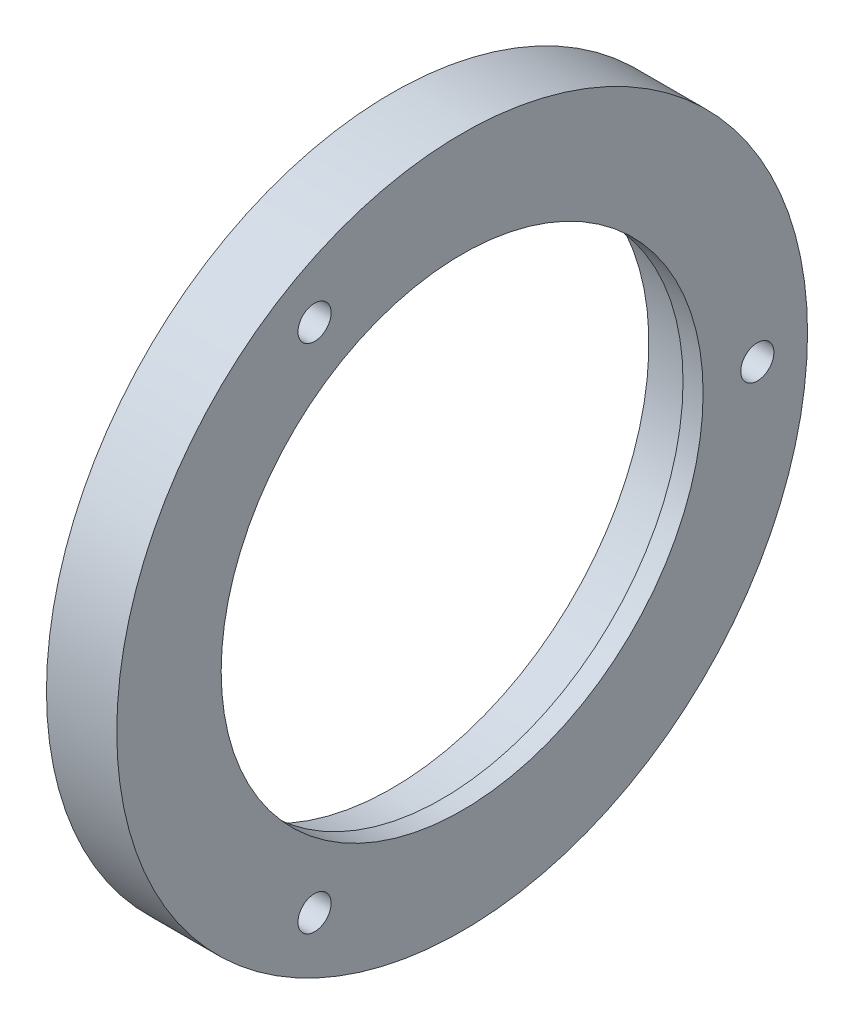
ISO-10303-21;
HEADER;
FILE_DESCRIPTION(('STEP AP214'),'2;1');
FILE_NAME('part.step','',(''),(''),'','','');
FILE_SCHEMA(('AUTOMOTIVE_DESIGN { 1 0 10303 214 1 1 1 1 }'));
ENDSEC;
DATA;
#1=APPLICATION_CONTEXT('core data for automotive mechanical design processes');
#2=APPLICATION_PROTOCOL_DEFINITION('international standard','automotive_design',2000,#1);
#3=PRODUCT_CONTEXT('',#1,'mechanical');
#4=PRODUCT('Part','Part','',(#3));
#5=PRODUCT_RELATED_PRODUCT_CATEGORY('part','',(#4));
#6=PRODUCT_DEFINITION_FORMATION('','',#4);
#7=PRODUCT_DEFINITION_CONTEXT('part definition',#1,'design');
#8=PRODUCT_DEFINITION('design','',#6,#7);
#9=PRODUCT_DEFINITION_SHAPE('','',#8);
#10=(LENGTH_UNIT() NAMED_UNIT(*) SI_UNIT(.MILLI.,.METRE.));
#11=(NAMED_UNIT(*) PLANE_ANGLE_UNIT() SI_UNIT($,.RADIAN.));
#12=(NAMED_UNIT(*) SI_UNIT($,.STERADIAN.) SOLID_ANGLE_UNIT());
#13=UNCERTAINTY_MEASURE_WITH_UNIT(LENGTH_MEASURE(1.E-05),#10,'distance_accuracy_value','');
#14=(GEOMETRIC_REPRESENTATION_CONTEXT(3) GLOBAL_UNCERTAINTY_ASSIGNED_CONTEXT((#13)) GLOBAL_UNIT_ASSIGNED_CONTEXT((#10,
#11,#12)) REPRESENTATION_CONTEXT('',''));
#15=CARTESIAN_POINT('',(0.,0.,0.));
#16=DIRECTION('',(0.,0.,1.));
#17=DIRECTION('',(1.,0.,0.));
#18=AXIS2_PLACEMENT_3D('',#15,#16,#17);
#19=CARTESIAN_POINT('',(169.7,34.4,0.));
#20=DIRECTION('',(1.,0.,0.));
#21=DIRECTION('',(0.,0.,-1.));
#22=AXIS2_PLACEMENT_3D('',#19,#20,#21);
#23=PLANE('',#22);
#24=CARTESIAN_POINT('',(169.7,0.,-29.4));
#25=DIRECTION('',(1.,0.,0.));
#26=DIRECTION('',(0.,0.,-1.));
#27=AXIS2_PLACEMENT_3D('',#24,#25,#26);
#28=CIRCLE('',#27,1.65);
#29=CARTESIAN_POINT('',(169.7,0.,-27.75));
#30=VERTEX_POINT('',#29);
#31=EDGE_CURVE('E68',#30,#30,#28,.F.);
#32=ORIENTED_EDGE('',*,*,#31,.F.);
#33=EDGE_LOOP('',(#32));
#34=FACE_BOUND('',#33,.T.);
#35=CARTESIAN_POINT('',(169.7,25.4611468712625,14.7));
#36=DIRECTION('',(1.,0.,0.));
#37=DIRECTION('',(0.,0.,-1.));
#38=AXIS2_PLACEMENT_3D('',#35,#36,#37);
#39=CIRCLE('',#38,1.65);
#40=CARTESIAN_POINT('',(169.7,25.4611468712625,16.35));
#41=VERTEX_POINT('',#40);
#42=EDGE_CURVE('E72',#41,#41,#39,.F.);
#43=ORIENTED_EDGE('',*,*,#42,.F.);
#44=EDGE_LOOP('',(#43));
#45=FACE_BOUND('',#44,.T.);
#46=CARTESIAN_POINT('',(169.7,-25.4611468712625,14.7));
#47=DIRECTION('',(1.,0.,0.));
#48=DIRECTION('',(0.,0.,-1.));
#49=AXIS2_PLACEMENT_3D('',#46,#47,#48);
#50=CIRCLE('',#49,1.65);
#51=CARTESIAN_POINT('',(169.7,-25.4611468712625,16.35));
#52=VERTEX_POINT('',#51);
#53=EDGE_CURVE('E76',#52,#52,#50,.F.);
#54=ORIENTED_EDGE('',*,*,#53,.F.);
#55=EDGE_LOOP('',(#54));
#56=FACE_BOUND('',#55,.T.);
#57=CARTESIAN_POINT('',(169.7,0.,0.));
#58=DIRECTION('',(-1.,0.,0.));
#59=DIRECTION('',(0.,0.,1.));
#60=AXIS2_PLACEMENT_3D('',#57,#58,#59);
#61=CIRCLE('',#60,25.6);
#62=CARTESIAN_POINT('',(169.7,0.,25.6));
#63=VERTEX_POINT('',#62);
#64=EDGE_CURVE('E10',#63,#63,#61,.T.);
#65=ORIENTED_EDGE('',*,*,#64,.F.);
#66=EDGE_LOOP('',(#65));
#67=FACE_BOUND('',#66,.T.);
#68=CARTESIAN_POINT('',(169.7,0.,0.));
#69=DIRECTION('',(-1.,0.,0.));
#70=DIRECTION('',(0.,0.,1.));
#71=AXIS2_PLACEMENT_3D('',#68,#69,#70);
#72=CIRCLE('',#71,34.4);
#73=CARTESIAN_POINT('',(169.7,0.,34.4));
#74=VERTEX_POINT('',#73);
#75=EDGE_CURVE('E64',#74,#74,#72,.T.);
#76=ORIENTED_EDGE('',*,*,#75,.T.);
#77=EDGE_LOOP('',(#76));
#78=FACE_BOUND('',#77,.T.);
#79=ADVANCED_FACE('F37',(#34,#45,#56,#67,#78),#23,.F.);
#80=CARTESIAN_POINT('',(-110.,0.,0.));
#81=DIRECTION('',(-1.,0.,0.));
#82=DIRECTION('',(0.,0.,1.));
#83=AXIS2_PLACEMENT_3D('',#80,#81,#82);
#84=CYLINDRICAL_SURFACE('',#83,25.6);
#85=CARTESIAN_POINT('',(174.7,0.,0.));
#86=DIRECTION('',(-1.,0.,0.));
#87=DIRECTION('',(0.,0.,1.));
#88=AXIS2_PLACEMENT_3D('',#85,#86,#87);
#89=CIRCLE('',#88,25.6);
#90=CARTESIAN_POINT('',(174.7,0.,25.6));
#91=VERTEX_POINT('',#90);
#92=EDGE_CURVE('E44',#91,#91,#89,.T.);
#93=ORIENTED_EDGE('',*,*,#92,.F.);
#94=EDGE_LOOP('',(#93));
#95=FACE_BOUND('',#94,.T.);
#96=ORIENTED_EDGE('',*,*,#64,.T.);
#97=EDGE_LOOP('',(#96));
#98=FACE_BOUND('',#97,.T.);
#99=ADVANCED_FACE('F117',(#95,#98),#84,.F.);
#100=CARTESIAN_POINT('',(174.7,25.6,0.));
#101=DIRECTION('',(1.,0.,0.));
#102=DIRECTION('',(0.,0.,-1.));
#103=AXIS2_PLACEMENT_3D('',#100,#101,#102);
#104=PLANE('',#103);
#105=CARTESIAN_POINT('',(174.7,0.,0.));
#106=DIRECTION('',(-1.,0.,0.));
#107=DIRECTION('',(0.,0.,1.));
#108=AXIS2_PLACEMENT_3D('',#105,#106,#107);
#109=CIRCLE('',#108,24.);
#110=CARTESIAN_POINT('',(174.7,0.,24.));
#111=VERTEX_POINT('',#110);
#112=EDGE_CURVE('E49',#111,#111,#109,.T.);
#113=ORIENTED_EDGE('',*,*,#112,.F.);
#114=EDGE_LOOP('',(#113));
#115=FACE_BOUND('',#114,.T.);
#116=ORIENTED_EDGE('',*,*,#92,.T.);
#117=EDGE_LOOP('',(#116));
#118=FACE_BOUND('',#117,.T.);
#119=ADVANCED_FACE('F112',(#115,#118),#104,.F.);
#120=CARTESIAN_POINT('',(-110.,0.,0.));
#121=DIRECTION('',(-1.,0.,0.));
#122=DIRECTION('',(0.,0.,1.));
#123=AXIS2_PLACEMENT_3D('',#120,#121,#122);
#124=CYLINDRICAL_SURFACE('',#123,24.);
#125=CARTESIAN_POINT('',(176.7,0.,0.));
#126=DIRECTION('',(-1.,0.,0.));
#127=DIRECTION('',(0.,0.,1.));
#128=AXIS2_PLACEMENT_3D('',#125,#126,#127);
#129=CIRCLE('',#128,24.);
#130=CARTESIAN_POINT('',(176.7,0.,24.));
#131=VERTEX_POINT('',#130);
#132=EDGE_CURVE('E54',#131,#131,#129,.T.);
#133=ORIENTED_EDGE('',*,*,#132,.F.);
#134=EDGE_LOOP('',(#133));
#135=FACE_BOUND('',#134,.T.);
#136=ORIENTED_EDGE('',*,*,#112,.T.);
#137=EDGE_LOOP('',(#136));
#138=FACE_BOUND('',#137,.T.);
#139=ADVANCED_FACE('F100',(#135,#138),#124,.F.);
#140=CARTESIAN_POINT('',(176.7,24.,0.));
#141=DIRECTION('',(-1.,0.,0.));
#142=DIRECTION('',(0.,0.,1.));
#143=AXIS2_PLACEMENT_3D('',#140,#141,#142);
#144=PLANE('',#143);
#145=CARTESIAN_POINT('',(176.7,0.,-29.4));
#146=DIRECTION('',(1.,0.,0.));
#147=DIRECTION('',(0.,0.,-1.));
#148=AXIS2_PLACEMENT_3D('',#145,#146,#147);
#149=CIRCLE('',#148,1.65);
#150=CARTESIAN_POINT('',(176.7,0.,-27.75));
#151=VERTEX_POINT('',#150);
#152=EDGE_CURVE('E80',#151,#151,#149,.T.);
#153=ORIENTED_EDGE('',*,*,#152,.F.);
#154=EDGE_LOOP('',(#153));
#155=FACE_BOUND('',#154,.T.);
#156=CARTESIAN_POINT('',(176.7,25.4611468712625,14.7));
#157=DIRECTION('',(1.,0.,0.));
#158=DIRECTION('',(0.,0.,-1.));
#159=AXIS2_PLACEMENT_3D('',#156,#157,#158);
#160=CIRCLE('',#159,1.65);
#161=CARTESIAN_POINT('',(176.7,25.4611468712625,16.35));
#162=VERTEX_POINT('',#161);
#163=EDGE_CURVE('E85',#162,#162,#160,.T.);
#164=ORIENTED_EDGE('',*,*,#163,.F.);
#165=EDGE_LOOP('',(#164));
#166=FACE_BOUND('',#165,.T.);
#167=CARTESIAN_POINT('',(176.7,-25.4611468712625,14.7));
#168=DIRECTION('',(1.,0.,0.));
#169=DIRECTION('',(0.,0.,-1.));
#170=AXIS2_PLACEMENT_3D('',#167,#168,#169);
#171=CIRCLE('',#170,1.65);
#172=CARTESIAN_POINT('',(176.7,-25.4611468712625,16.35));
#173=VERTEX_POINT('',#172);
#174=EDGE_CURVE('E81',#173,#173,#171,.T.);
#175=ORIENTED_EDGE('',*,*,#174,.F.);
#176=EDGE_LOOP('',(#175));
#177=FACE_BOUND('',#176,.T.);
#178=CARTESIAN_POINT('',(176.7,0.,0.));
#179=DIRECTION('',(-1.,0.,0.));
#180=DIRECTION('',(0.,0.,1.));
#181=AXIS2_PLACEMENT_3D('',#178,#179,#180);
#182=CIRCLE('',#181,34.4);
#183=CARTESIAN_POINT('',(176.7,0.,34.4));
#184=VERTEX_POINT('',#183);
#185=EDGE_CURVE('E60',#184,#184,#182,.T.);
#186=ORIENTED_EDGE('',*,*,#185,.F.);
#187=EDGE_LOOP('',(#186));
#188=FACE_BOUND('',#187,.T.);
#189=ORIENTED_EDGE('',*,*,#132,.T.);
#190=EDGE_LOOP('',(#189));
#191=FACE_BOUND('',#190,.T.);
#192=ADVANCED_FACE('F96',(#155,#166,#177,#188,#191),#144,.F.);
#193=CARTESIAN_POINT('',(-110.,0.,0.));
#194=DIRECTION('',(-1.,0.,0.));
#195=DIRECTION('',(0.,0.,1.));
#196=AXIS2_PLACEMENT_3D('',#193,#194,#195);
#197=CYLINDRICAL_SURFACE('',#196,34.4);
#198=ORIENTED_EDGE('',*,*,#75,.F.);
#199=EDGE_LOOP('',(#198));
#200=FACE_BOUND('',#199,.T.);
#201=ORIENTED_EDGE('',*,*,#185,.T.);
#202=EDGE_LOOP('',(#201));
#203=FACE_BOUND('',#202,.T.);
#204=ADVANCED_FACE('F99',(#200,#203),#197,.T.);
#205=CARTESIAN_POINT('',(169.7,-25.4611468712625,14.7));
#206=DIRECTION('',(-1.,0.,0.));
#207=DIRECTION('',(0.,0.,1.));
#208=AXIS2_PLACEMENT_3D('',#205,#206,#207);
#209=CYLINDRICAL_SURFACE('',#208,1.65);
#210=CARTESIAN_POINT('',(176.7,-25.4611468712625,16.35));
#211=CARTESIAN_POINT('',(176.627083333333,-25.4611468712625,16.35));
#212=CARTESIAN_POINT('',(176.554166666667,-25.4611468712625,16.35));
#213=CARTESIAN_POINT('',(176.408333333333,-25.4611468712625,16.35));
#214=CARTESIAN_POINT('',(176.335416666667,-25.4611468712625,16.35));
#215=CARTESIAN_POINT('',(176.189583333333,-25.4611468712625,16.35));
#216=CARTESIAN_POINT('',(176.116666666667,-25.4611468712625,16.35));
#217=CARTESIAN_POINT('',(175.970833333333,-25.4611468712625,16.35));
#218=CARTESIAN_POINT('',(175.897916666667,-25.4611468712625,16.35));
#219=CARTESIAN_POINT('',(175.752083333333,-25.4611468712625,16.35));
#220=CARTESIAN_POINT('',(175.679166666667,-25.4611468712625,16.35));
#221=CARTESIAN_POINT('',(175.533333333333,-25.4611468712625,16.35));
#222=CARTESIAN_POINT('',(175.460416666667,-25.4611468712625,16.35));
#223=CARTESIAN_POINT('',(175.314583333333,-25.4611468712625,16.35));
#224=CARTESIAN_POINT('',(175.241666666667,-25.4611468712625,16.35));
#225=CARTESIAN_POINT('',(175.095833333333,-25.4611468712625,16.35));
#226=CARTESIAN_POINT('',(175.022916666667,-25.4611468712625,16.35));
#227=CARTESIAN_POINT('',(174.877083333333,-25.4611468712625,16.35));
#228=CARTESIAN_POINT('',(174.804166666667,-25.4611468712625,16.35));
#229=CARTESIAN_POINT('',(174.658333333333,-25.4611468712625,16.35));
#230=CARTESIAN_POINT('',(174.585416666667,-25.4611468712625,16.35));
#231=CARTESIAN_POINT('',(174.439583333333,-25.4611468712625,16.35));
#232=CARTESIAN_POINT('',(174.366666666667,-25.4611468712625,16.35));
#233=CARTESIAN_POINT('',(174.220833333333,-25.4611468712625,16.35));
#234=CARTESIAN_POINT('',(174.147916666667,-25.4611468712625,16.35));
#235=CARTESIAN_POINT('',(174.002083333333,-25.4611468712625,16.35));
#236=CARTESIAN_POINT('',(173.929166666667,-25.4611468712625,16.35));
#237=CARTESIAN_POINT('',(173.783333333333,-25.4611468712625,16.35));
#238=CARTESIAN_POINT('',(173.710416666667,-25.4611468712625,16.35));
#239=CARTESIAN_POINT('',(173.564583333333,-25.4611468712625,16.35));
#240=CARTESIAN_POINT('',(173.491666666667,-25.4611468712625,16.35));
#241=CARTESIAN_POINT('',(173.345833333333,-25.4611468712625,16.35));
#242=CARTESIAN_POINT('',(173.272916666667,-25.4611468712625,16.35));
#243=CARTESIAN_POINT('',(173.127083333333,-25.4611468712625,16.35));
#244=CARTESIAN_POINT('',(173.054166666667,-25.4611468712625,16.35));
#245=CARTESIAN_POINT('',(172.908333333333,-25.4611468712625,16.35));
#246=CARTESIAN_POINT('',(172.835416666667,-25.4611468712625,16.35));
#247=CARTESIAN_POINT('',(172.689583333333,-25.4611468712625,16.35));
#248=CARTESIAN_POINT('',(172.616666666667,-25.4611468712625,16.35));
#249=CARTESIAN_POINT('',(172.470833333333,-25.4611468712625,16.35));
#250=CARTESIAN_POINT('',(172.397916666667,-25.4611468712625,16.35));
#251=CARTESIAN_POINT('',(172.252083333333,-25.4611468712625,16.35));
#252=CARTESIAN_POINT('',(172.179166666667,-25.4611468712625,16.35));
#253=CARTESIAN_POINT('',(172.033333333333,-25.4611468712625,16.35));
#254=CARTESIAN_POINT('',(171.960416666667,-25.4611468712625,16.35));
#255=CARTESIAN_POINT('',(171.814583333333,-25.4611468712625,16.35));
#256=CARTESIAN_POINT('',(171.741666666667,-25.4611468712625,16.35));
#257=CARTESIAN_POINT('',(171.595833333333,-25.4611468712625,16.35));
#258=CARTESIAN_POINT('',(171.522916666667,-25.4611468712625,16.35));
#259=CARTESIAN_POINT('',(171.377083333333,-25.4611468712625,16.35));
#260=CARTESIAN_POINT('',(171.304166666667,-25.4611468712625,16.35));
#261=CARTESIAN_POINT('',(171.158333333333,-25.4611468712625,16.35));
#262=CARTESIAN_POINT('',(171.085416666667,-25.4611468712625,16.35));
#263=CARTESIAN_POINT('',(170.939583333333,-25.4611468712625,16.35));
#264=CARTESIAN_POINT('',(170.866666666667,-25.4611468712625,16.35));
#265=CARTESIAN_POINT('',(170.720833333333,-25.4611468712625,16.35));
#266=CARTESIAN_POINT('',(170.647916666667,-25.4611468712625,16.35));
#267=CARTESIAN_POINT('',(170.502083333333,-25.4611468712625,16.35));
#268=CARTESIAN_POINT('',(170.429166666667,-25.4611468712625,16.35));
#269=CARTESIAN_POINT('',(170.283333333333,-25.4611468712625,16.35));
#270=CARTESIAN_POINT('',(170.210416666667,-25.4611468712625,16.35));
#271=CARTESIAN_POINT('',(170.064583333333,-25.4611468712625,16.35));
#272=CARTESIAN_POINT('',(169.991666666667,-25.4611468712625,16.35));
#273=CARTESIAN_POINT('',(169.845833333333,-25.4611468712625,16.35));
#274=CARTESIAN_POINT('',(169.772916666667,-25.4611468712625,16.35));
#275=CARTESIAN_POINT('',(169.7,-25.4611468712625,16.35));
#276=B_SPLINE_CURVE_WITH_KNOTS('',3,(#210,#211,#212,#213,#214,#215,#216,#217,#218,#219,#220,
#221,#222,#223,#224,#225,#226,#227,#228,#229,#230,#231,#232,#233,#234,#235,#236,#237,#238,#239,
#240,#241,#242,#243,#244,#245,#246,#247,#248,#249,#250,#251,#252,#253,#254,#255,#256,#257,#258,
#259,#260,#261,#262,#263,#264,#265,#266,#267,#268,#269,#270,#271,#272,#273,#274,#275),
.UNSPECIFIED.,.F.,.F.,(4,2,2,2,2,2,2,2,2,2,2,2,2,2,2,2,2,2,2,2,2,2,2,2,2,2,2,2,2,2,2,2,4),(0.,
0.21874999999999,0.43749999999998,0.656249999999997,0.874999999999987,1.09375,1.31249999999999,
1.53124999999998,1.75,1.96874999999999,2.18750000000001,2.40625,2.62499999999999,
2.84375000000001,3.0625,3.28125000000001,3.5,3.71874999999999,3.93750000000001,4.15625,
4.37500000000002,4.59375000000001,4.8125,5.03125000000002,5.25,5.46875000000002,
5.68750000000001,5.90625,6.12500000000002,6.34375000000001,6.56250000000003,6.78125000000002,
7.00000000000001),.UNSPECIFIED.);
#277=EDGE_CURVE('BSEAM138',#173,#52,#276,.T.);
#278=ORIENTED_EDGE('',*,*,#174,.T.);
#279=ORIENTED_EDGE('',*,*,#53,.T.);
#280=ORIENTED_EDGE('',*,*,#277,.T.);
#281=ORIENTED_EDGE('',*,*,#277,.F.);
#282=EDGE_LOOP('',(#278,#280,#279,#281));
#283=FACE_BOUND('',#282,.T.);
#284=ADVANCED_FACE('F138',(#283),#209,.F.);
#285=CARTESIAN_POINT('',(169.7,25.4611468712625,14.7));
#286=DIRECTION('',(-1.,0.,0.));
#287=DIRECTION('',(0.,0.,1.));
#288=AXIS2_PLACEMENT_3D('',#285,#286,#287);
#289=CYLINDRICAL_SURFACE('',#288,1.65);
#290=CARTESIAN_POINT('',(176.7,25.4611468712625,16.35));
#291=CARTESIAN_POINT('',(176.627083333333,25.4611468712625,16.35));
#292=CARTESIAN_POINT('',(176.554166666667,25.4611468712625,16.35));
#293=CARTESIAN_POINT('',(176.408333333333,25.4611468712625,16.35));
#294=CARTESIAN_POINT('',(176.335416666667,25.4611468712625,16.35));
#295=CARTESIAN_POINT('',(176.189583333333,25.4611468712625,16.35));
#296=CARTESIAN_POINT('',(176.116666666667,25.4611468712625,16.35));
#297=CARTESIAN_POINT('',(175.970833333333,25.4611468712625,16.35));
#298=CARTESIAN_POINT('',(175.897916666667,25.4611468712625,16.35));
#299=CARTESIAN_POINT('',(175.752083333333,25.4611468712625,16.35));
#300=CARTESIAN_POINT('',(175.679166666667,25.4611468712625,16.35));
#301=CARTESIAN_POINT('',(175.533333333333,25.4611468712625,16.35));
#302=CARTESIAN_POINT('',(175.460416666667,25.4611468712625,16.35));
#303=CARTESIAN_POINT('',(175.314583333333,25.4611468712625,16.35));
#304=CARTESIAN_POINT('',(175.241666666667,25.4611468712625,16.35));
#305=CARTESIAN_POINT('',(175.095833333333,25.4611468712625,16.35));
#306=CARTESIAN_POINT('',(175.022916666667,25.4611468712625,16.35));
#307=CARTESIAN_POINT('',(174.877083333333,25.4611468712625,16.35));
#308=CARTESIAN_POINT('',(174.804166666667,25.4611468712625,16.35));
#309=CARTESIAN_POINT('',(174.658333333333,25.4611468712625,16.35));
#310=CARTESIAN_POINT('',(174.585416666667,25.4611468712625,16.35));
#311=CARTESIAN_POINT('',(174.439583333333,25.4611468712625,16.35));
#312=CARTESIAN_POINT('',(174.366666666667,25.4611468712625,16.35));
#313=CARTESIAN_POINT('',(174.220833333333,25.4611468712625,16.35));
#314=CARTESIAN_POINT('',(174.147916666667,25.4611468712625,16.35));
#315=CARTESIAN_POINT('',(174.002083333333,25.4611468712625,16.35));
#316=CARTESIAN_POINT('',(173.929166666667,25.4611468712625,16.35));
#317=CARTESIAN_POINT('',(173.783333333333,25.4611468712625,16.35));
#318=CARTESIAN_POINT('',(173.710416666667,25.4611468712625,16.35));
#319=CARTESIAN_POINT('',(173.564583333333,25.4611468712625,16.35));
#320=CARTESIAN_POINT('',(173.491666666667,25.4611468712625,16.35));
#321=CARTESIAN_POINT('',(173.345833333333,25.4611468712625,16.35));
#322=CARTESIAN_POINT('',(173.272916666667,25.4611468712625,16.35));
#323=CARTESIAN_POINT('',(173.127083333333,25.4611468712625,16.35));
#324=CARTESIAN_POINT('',(173.054166666667,25.4611468712625,16.35));
#325=CARTESIAN_POINT('',(172.908333333333,25.4611468712625,16.35));
#326=CARTESIAN_POINT('',(172.835416666667,25.4611468712625,16.35));
#327=CARTESIAN_POINT('',(172.689583333333,25.4611468712625,16.35));
#328=CARTESIAN_POINT('',(172.616666666667,25.4611468712625,16.35));
#329=CARTESIAN_POINT('',(172.470833333333,25.4611468712625,16.35));
#330=CARTESIAN_POINT('',(172.397916666667,25.4611468712625,16.35));
#331=CARTESIAN_POINT('',(172.252083333333,25.4611468712625,16.35));
#332=CARTESIAN_POINT('',(172.179166666667,25.4611468712625,16.35));
#333=CARTESIAN_POINT('',(172.033333333333,25.4611468712625,16.35));
#334=CARTESIAN_POINT('',(171.960416666667,25.4611468712625,16.35));
#335=CARTESIAN_POINT('',(171.814583333333,25.4611468712625,16.35));
#336=CARTESIAN_POINT('',(171.741666666667,25.4611468712625,16.35));
#337=CARTESIAN_POINT('',(171.595833333333,25.4611468712625,16.35));
#338=CARTESIAN_POINT('',(171.522916666667,25.4611468712625,16.35));
#339=CARTESIAN_POINT('',(171.377083333333,25.4611468712625,16.35));
#340=CARTESIAN_POINT('',(171.304166666667,25.4611468712625,16.35));
#341=CARTESIAN_POINT('',(171.158333333333,25.4611468712625,16.35));
#342=CARTESIAN_POINT('',(171.085416666667,25.4611468712625,16.35));
#343=CARTESIAN_POINT('',(170.939583333333,25.4611468712625,16.35));
#344=CARTESIAN_POINT('',(170.866666666667,25.4611468712625,16.35));
#345=CARTESIAN_POINT('',(170.720833333333,25.4611468712625,16.35));
#346=CARTESIAN_POINT('',(170.647916666667,25.4611468712625,16.35));
#347=CARTESIAN_POINT('',(170.502083333333,25.4611468712625,16.35));
#348=CARTESIAN_POINT('',(170.429166666667,25.4611468712625,16.35));
#349=CARTESIAN_POINT('',(170.283333333333,25.4611468712625,16.35));
#350=CARTESIAN_POINT('',(170.210416666667,25.4611468712625,16.35));
#351=CARTESIAN_POINT('',(170.064583333333,25.4611468712625,16.35));
#352=CARTESIAN_POINT('',(169.991666666667,25.4611468712625,16.35));
#353=CARTESIAN_POINT('',(169.845833333333,25.4611468712625,16.35));
#354=CARTESIAN_POINT('',(169.772916666667,25.4611468712625,16.35));
#355=CARTESIAN_POINT('',(169.7,25.4611468712625,16.35));
#356=B_SPLINE_CURVE_WITH_KNOTS('',3,(#290,#291,#292,#293,#294,#295,#296,#297,#298,#299,#300,
#301,#302,#303,#304,#305,#306,#307,#308,#309,#310,#311,#312,#313,#314,#315,#316,#317,#318,#319,
#320,#321,#322,#323,#324,#325,#326,#327,#328,#329,#330,#331,#332,#333,#334,#335,#336,#337,#338,
#339,#340,#341,#342,#343,#344,#345,#346,#347,#348,#349,#350,#351,#352,#353,#354,#355),
.UNSPECIFIED.,.F.,.F.,(4,2,2,2,2,2,2,2,2,2,2,2,2,2,2,2,2,2,2,2,2,2,2,2,2,2,2,2,2,2,2,2,4),(0.,
0.21874999999999,0.43749999999998,0.656249999999997,0.874999999999987,1.09375,1.31249999999999,
1.53124999999998,1.75,1.96874999999999,2.18750000000001,2.40625,2.62499999999999,
2.84375000000001,3.0625,3.28125000000001,3.5,3.71874999999999,3.93750000000001,4.15625,
4.37500000000002,4.59375000000001,4.8125,5.03125000000002,5.25,5.46875000000002,
5.68750000000001,5.90625,6.12500000000002,6.34375000000001,6.56250000000003,6.78125000000002,
7.00000000000001),.UNSPECIFIED.);
#357=EDGE_CURVE('BSEAM143',#162,#41,#356,.T.);
#358=ORIENTED_EDGE('',*,*,#163,.T.);
#359=ORIENTED_EDGE('',*,*,#42,.T.);
#360=ORIENTED_EDGE('',*,*,#357,.T.);
#361=ORIENTED_EDGE('',*,*,#357,.F.);
#362=EDGE_LOOP('',(#358,#360,#359,#361));
#363=FACE_BOUND('',#362,.T.);
#364=ADVANCED_FACE('F143',(#363),#289,.F.);
#365=CARTESIAN_POINT('',(169.7,0.,-29.4));
#366=DIRECTION('',(-1.,0.,0.));
#367=DIRECTION('',(0.,0.,1.));
#368=AXIS2_PLACEMENT_3D('',#365,#366,#367);
#369=CYLINDRICAL_SURFACE('',#368,1.65);
#370=CARTESIAN_POINT('',(176.7,0.,-27.75));
#371=CARTESIAN_POINT('',(176.627083333333,0.,-27.75));
#372=CARTESIAN_POINT('',(176.554166666667,0.,-27.75));
#373=CARTESIAN_POINT('',(176.408333333333,0.,-27.75));
#374=CARTESIAN_POINT('',(176.335416666667,0.,-27.75));
#375=CARTESIAN_POINT('',(176.189583333333,0.,-27.75));
#376=CARTESIAN_POINT('',(176.116666666667,0.,-27.75));
#377=CARTESIAN_POINT('',(175.970833333333,0.,-27.75));
#378=CARTESIAN_POINT('',(175.897916666667,0.,-27.75));
#379=CARTESIAN_POINT('',(175.752083333333,0.,-27.75));
#380=CARTESIAN_POINT('',(175.679166666667,0.,-27.75));
#381=CARTESIAN_POINT('',(175.533333333333,0.,-27.75));
#382=CARTESIAN_POINT('',(175.460416666667,0.,-27.75));
#383=CARTESIAN_POINT('',(175.314583333333,0.,-27.75));
#384=CARTESIAN_POINT('',(175.241666666667,0.,-27.75));
#385=CARTESIAN_POINT('',(175.095833333333,0.,-27.75));
#386=CARTESIAN_POINT('',(175.022916666667,0.,-27.75));
#387=CARTESIAN_POINT('',(174.877083333333,0.,-27.75));
#388=CARTESIAN_POINT('',(174.804166666667,0.,-27.75));
#389=CARTESIAN_POINT('',(174.658333333333,0.,-27.75));
#390=CARTESIAN_POINT('',(174.585416666667,0.,-27.75));
#391=CARTESIAN_POINT('',(174.439583333333,0.,-27.75));
#392=CARTESIAN_POINT('',(174.366666666667,0.,-27.75));
#393=CARTESIAN_POINT('',(174.220833333333,0.,-27.75));
#394=CARTESIAN_POINT('',(174.147916666667,0.,-27.75));
#395=CARTESIAN_POINT('',(174.002083333333,0.,-27.75));
#396=CARTESIAN_POINT('',(173.929166666667,0.,-27.75));
#397=CARTESIAN_POINT('',(173.783333333333,0.,-27.75));
#398=CARTESIAN_POINT('',(173.710416666667,0.,-27.75));
#399=CARTESIAN_POINT('',(173.564583333333,0.,-27.75));
#400=CARTESIAN_POINT('',(173.491666666667,0.,-27.75));
#401=CARTESIAN_POINT('',(173.345833333333,0.,-27.75));
#402=CARTESIAN_POINT('',(173.272916666667,0.,-27.75));
#403=CARTESIAN_POINT('',(173.127083333333,0.,-27.75));
#404=CARTESIAN_POINT('',(173.054166666667,0.,-27.75));
#405=CARTESIAN_POINT('',(172.908333333333,0.,-27.75));
#406=CARTESIAN_POINT('',(172.835416666667,0.,-27.75));
#407=CARTESIAN_POINT('',(172.689583333333,0.,-27.75));
#408=CARTESIAN_POINT('',(172.616666666667,0.,-27.75));
#409=CARTESIAN_POINT('',(172.470833333333,0.,-27.75));
#410=CARTESIAN_POINT('',(172.397916666667,0.,-27.75));
#411=CARTESIAN_POINT('',(172.252083333333,0.,-27.75));
#412=CARTESIAN_POINT('',(172.179166666667,0.,-27.75));
#413=CARTESIAN_POINT('',(172.033333333333,0.,-27.75));
#414=CARTESIAN_POINT('',(171.960416666667,0.,-27.75));
#415=CARTESIAN_POINT('',(171.814583333333,0.,-27.75));
#416=CARTESIAN_POINT('',(171.741666666667,0.,-27.75));
#417=CARTESIAN_POINT('',(171.595833333333,0.,-27.75));
#418=CARTESIAN_POINT('',(171.522916666667,0.,-27.75));
#419=CARTESIAN_POINT('',(171.377083333333,0.,-27.75));
#420=CARTESIAN_POINT('',(171.304166666667,0.,-27.75));
#421=CARTESIAN_POINT('',(171.158333333333,0.,-27.75));
#422=CARTESIAN_POINT('',(171.085416666667,0.,-27.75));
#423=CARTESIAN_POINT('',(170.939583333333,0.,-27.75));
#424=CARTESIAN_POINT('',(170.866666666667,0.,-27.75));
#425=CARTESIAN_POINT('',(170.720833333333,0.,-27.75));
#426=CARTESIAN_POINT('',(170.647916666667,0.,-27.75));
#427=CARTESIAN_POINT('',(170.502083333333,0.,-27.75));
#428=CARTESIAN_POINT('',(170.429166666667,0.,-27.75));
#429=CARTESIAN_POINT('',(170.283333333333,0.,-27.75));
#430=CARTESIAN_POINT('',(170.210416666667,0.,-27.75));
#431=CARTESIAN_POINT('',(170.064583333333,0.,-27.75));
#432=CARTESIAN_POINT('',(169.991666666667,0.,-27.75));
#433=CARTESIAN_POINT('',(169.845833333333,0.,-27.75));
#434=CARTESIAN_POINT('',(169.772916666667,0.,-27.75));
#435=CARTESIAN_POINT('',(169.7,0.,-27.75));
#436=B_SPLINE_CURVE_WITH_KNOTS('',3,(#370,#371,#372,#373,#374,#375,#376,#377,#378,#379,#380,
#381,#382,#383,#384,#385,#386,#387,#388,#389,#390,#391,#392,#393,#394,#395,#396,#397,#398,#399,
#400,#401,#402,#403,#404,#405,#406,#407,#408,#409,#410,#411,#412,#413,#414,#415,#416,#417,#418,
#419,#420,#421,#422,#423,#424,#425,#426,#427,#428,#429,#430,#431,#432,#433,#434,#435),
.UNSPECIFIED.,.F.,.F.,(4,2,2,2,2,2,2,2,2,2,2,2,2,2,2,2,2,2,2,2,2,2,2,2,2,2,2,2,2,2,2,2,4),(0.,
0.21874999999999,0.43749999999998,0.656249999999997,0.874999999999987,1.09375,1.31249999999999,
1.53124999999998,1.75,1.96874999999999,2.18750000000001,2.40625,2.62499999999999,
2.84375000000001,3.0625,3.28125000000001,3.5,3.71874999999999,3.93750000000001,4.15625,
4.37500000000002,4.59375000000001,4.8125,5.03125000000002,5.25,5.46875000000002,
5.68750000000001,5.90625,6.12500000000002,6.34375000000001,6.56250000000003,6.78125000000002,
7.00000000000001),.UNSPECIFIED.);
#437=EDGE_CURVE('BSEAM93',#151,#30,#436,.T.);
#438=ORIENTED_EDGE('',*,*,#152,.T.);
#439=ORIENTED_EDGE('',*,*,#31,.T.);
#440=ORIENTED_EDGE('',*,*,#437,.T.);
#441=ORIENTED_EDGE('',*,*,#437,.F.);
#442=EDGE_LOOP('',(#438,#440,#439,#441));
#443=FACE_BOUND('',#442,.T.);
#444=ADVANCED_FACE('F93',(#443),#369,.F.);
#445=CLOSED_SHELL('',(#79,#99,#119,#139,#192,#204,#284,#364,#444));
#446=MANIFOLD_SOLID_BREP('B2',#445);
#447=ADVANCED_BREP_SHAPE_REPRESENTATION('',(#18,#446),#14);
#448=SHAPE_DEFINITION_REPRESENTATION(#9,#447);
ENDSEC;
END-ISO-10303-21;
